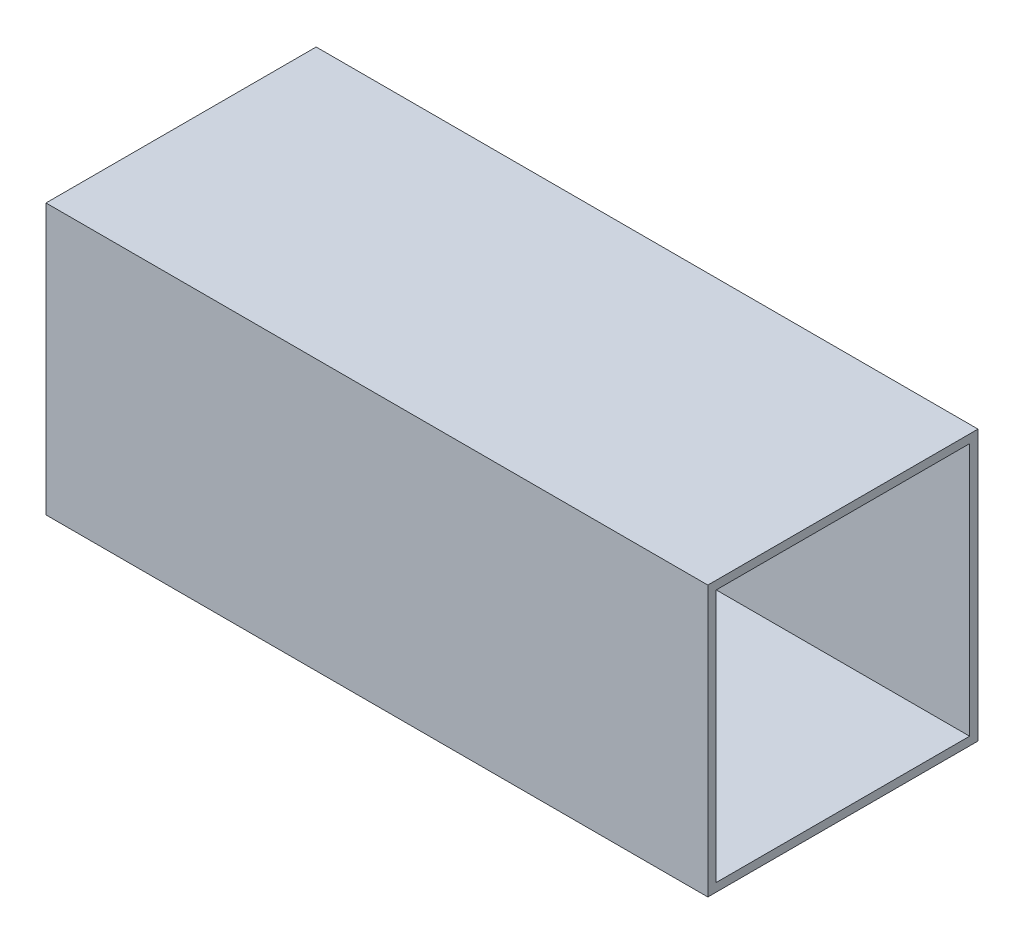
ISO-10303-21;
HEADER;
FILE_DESCRIPTION(('STEP AP214'),'2;1');
FILE_NAME('part.step','',(''),(''),'','','');
FILE_SCHEMA(('AUTOMOTIVE_DESIGN { 1 0 10303 214 1 1 1 1 }'));
ENDSEC;
DATA;
#1=APPLICATION_CONTEXT('core data for automotive mechanical design processes');
#2=APPLICATION_PROTOCOL_DEFINITION('international standard','automotive_design',2000,#1);
#3=PRODUCT_CONTEXT('',#1,'mechanical');
#4=PRODUCT('Part','Part','',(#3));
#5=PRODUCT_RELATED_PRODUCT_CATEGORY('part','',(#4));
#6=PRODUCT_DEFINITION_FORMATION('','',#4);
#7=PRODUCT_DEFINITION_CONTEXT('part definition',#1,'design');
#8=PRODUCT_DEFINITION('design','',#6,#7);
#9=PRODUCT_DEFINITION_SHAPE('','',#8);
#10=(LENGTH_UNIT() NAMED_UNIT(*) SI_UNIT(.MILLI.,.METRE.));
#11=(NAMED_UNIT(*) PLANE_ANGLE_UNIT() SI_UNIT($,.RADIAN.));
#12=(NAMED_UNIT(*) SI_UNIT($,.STERADIAN.) SOLID_ANGLE_UNIT());
#13=UNCERTAINTY_MEASURE_WITH_UNIT(LENGTH_MEASURE(1.E-05),#10,'distance_accuracy_value','');
#14=(GEOMETRIC_REPRESENTATION_CONTEXT(3) GLOBAL_UNCERTAINTY_ASSIGNED_CONTEXT((#13)) GLOBAL_UNIT_ASSIGNED_CONTEXT((#10,
#11,#12)) REPRESENTATION_CONTEXT('',''));
#15=CARTESIAN_POINT('',(0.,0.,0.));
#16=DIRECTION('',(0.,0.,1.));
#17=DIRECTION('',(1.,0.,0.));
#18=AXIS2_PLACEMENT_3D('',#15,#16,#17);
#19=CARTESIAN_POINT('',(70.0000000000005,14.2875,14.2875));
#20=DIRECTION('',(0.,-1.,0.));
#21=DIRECTION('',(0.,0.,-1.));
#22=AXIS2_PLACEMENT_3D('',#19,#20,#21);
#23=PLANE('',#22);
#24=DIRECTION('',(0.,0.,1.));
#25=VECTOR('',#24,1.);
#26=CARTESIAN_POINT('',(0.,14.2875,14.2875));
#27=LINE('',#26,#25);
#28=CARTESIAN_POINT('',(0.,14.2875,-14.2875));
#29=VERTEX_POINT('',#28);
#30=CARTESIAN_POINT('',(0.,14.2875,14.2875));
#31=VERTEX_POINT('',#30);
#32=EDGE_CURVE('E153',#29,#31,#27,.T.);
#33=ORIENTED_EDGE('',*,*,#32,.T.);
#34=DIRECTION('',(-1.00000000000001,0.,0.));
#35=VECTOR('',#34,1.);
#36=CARTESIAN_POINT('',(70.0000000000005,14.2875,14.2875));
#37=LINE('',#36,#35);
#38=CARTESIAN_POINT('',(70.0000000000005,14.2875,14.2875));
#39=VERTEX_POINT('',#38);
#40=EDGE_CURVE('E12',#39,#31,#37,.T.);
#41=ORIENTED_EDGE('',*,*,#40,.F.);
#42=DIRECTION('',(0.,0.,1.));
#43=VECTOR('',#42,1.);
#44=CARTESIAN_POINT('',(70.0000000000005,14.2875,14.2875));
#45=LINE('',#44,#43);
#46=CARTESIAN_POINT('',(70.0000000000003,14.2875,-14.2875));
#47=VERTEX_POINT('',#46);
#48=EDGE_CURVE('E127',#47,#39,#45,.T.);
#49=ORIENTED_EDGE('',*,*,#48,.F.);
#50=DIRECTION('',(-1.00000000000001,0.,0.));
#51=VECTOR('',#50,1.);
#52=CARTESIAN_POINT('',(70.0000000000003,14.2875,-14.2875));
#53=LINE('',#52,#51);
#54=EDGE_CURVE('E160',#47,#29,#53,.T.);
#55=ORIENTED_EDGE('',*,*,#54,.T.);
#56=EDGE_LOOP('',(#33,#41,#49,#55));
#57=FACE_BOUND('',#56,.T.);
#58=ADVANCED_FACE('F46',(#57),#23,.F.);
#59=CARTESIAN_POINT('',(70.0000000000005,14.2875,14.2875));
#60=DIRECTION('',(0.,0.,-1.));
#61=DIRECTION('',(-1.00000000000001,0.,0.));
#62=AXIS2_PLACEMENT_3D('',#59,#60,#61);
#63=PLANE('',#62);
#64=DIRECTION('',(0.,-1.,0.));
#65=VECTOR('',#64,1.);
#66=CARTESIAN_POINT('',(0.,14.2875,14.2875));
#67=LINE('',#66,#65);
#68=CARTESIAN_POINT('',(0.,-14.2875,14.2875));
#69=VERTEX_POINT('',#68);
#70=EDGE_CURVE('E132',#31,#69,#67,.T.);
#71=ORIENTED_EDGE('',*,*,#70,.T.);
#72=DIRECTION('',(-1.00000000000001,0.,0.));
#73=VECTOR('',#72,1.);
#74=CARTESIAN_POINT('',(70.0000000000006,-14.2875,14.2875));
#75=LINE('',#74,#73);
#76=CARTESIAN_POINT('',(70.0000000000006,-14.2875,14.2875));
#77=VERTEX_POINT('',#76);
#78=EDGE_CURVE('E56',#77,#69,#75,.T.);
#79=ORIENTED_EDGE('',*,*,#78,.F.);
#80=DIRECTION('',(0.,-1.,0.));
#81=VECTOR('',#80,1.);
#82=CARTESIAN_POINT('',(70.0000000000005,14.2875,14.2875));
#83=LINE('',#82,#81);
#84=EDGE_CURVE('E121',#39,#77,#83,.T.);
#85=ORIENTED_EDGE('',*,*,#84,.F.);
#86=ORIENTED_EDGE('',*,*,#40,.T.);
#87=EDGE_LOOP('',(#71,#79,#85,#86));
#88=FACE_BOUND('',#87,.T.);
#89=ADVANCED_FACE('F131',(#88),#63,.F.);
#90=CARTESIAN_POINT('',(70.0000000000005,-14.2875,-14.2875));
#91=DIRECTION('',(0.,1.,0.));
#92=DIRECTION('',(0.,0.,1.));
#93=AXIS2_PLACEMENT_3D('',#90,#91,#92);
#94=PLANE('',#93);
#95=DIRECTION('',(0.,0.,-1.));
#96=VECTOR('',#95,1.);
#97=CARTESIAN_POINT('',(0.,-14.2875,-14.2875));
#98=LINE('',#97,#96);
#99=CARTESIAN_POINT('',(0.,-14.2875,-14.2875));
#100=VERTEX_POINT('',#99);
#101=EDGE_CURVE('E94',#69,#100,#98,.T.);
#102=ORIENTED_EDGE('',*,*,#101,.T.);
#103=DIRECTION('',(-1.00000000000001,0.,0.));
#104=VECTOR('',#103,1.);
#105=CARTESIAN_POINT('',(70.0000000000005,-14.2875,-14.2875));
#106=LINE('',#105,#104);
#107=CARTESIAN_POINT('',(70.0000000000005,-14.2875,-14.2875));
#108=VERTEX_POINT('',#107);
#109=EDGE_CURVE('E133',#108,#100,#106,.T.);
#110=ORIENTED_EDGE('',*,*,#109,.F.);
#111=DIRECTION('',(0.,0.,-1.));
#112=VECTOR('',#111,1.);
#113=CARTESIAN_POINT('',(70.0000000000005,-14.2875,-14.2875));
#114=LINE('',#113,#112);
#115=EDGE_CURVE('E125',#77,#108,#114,.T.);
#116=ORIENTED_EDGE('',*,*,#115,.F.);
#117=ORIENTED_EDGE('',*,*,#78,.T.);
#118=EDGE_LOOP('',(#102,#110,#116,#117));
#119=FACE_BOUND('',#118,.T.);
#120=ADVANCED_FACE('F135',(#119),#94,.F.);
#121=CARTESIAN_POINT('',(70.0000000000005,13.3985,13.3985000000001));
#122=DIRECTION('',(0.,0.,-1.));
#123=DIRECTION('',(-1.00000000000001,0.,0.));
#124=AXIS2_PLACEMENT_3D('',#121,#122,#123);
#125=PLANE('',#124);
#126=DIRECTION('',(0.,-1.,0.));
#127=VECTOR('',#126,1.);
#128=CARTESIAN_POINT('',(0.,13.3985,13.3985000000001));
#129=LINE('',#128,#127);
#130=CARTESIAN_POINT('',(0.,13.3985,13.3985000000001));
#131=VERTEX_POINT('',#130);
#132=CARTESIAN_POINT('',(0.,-13.3985,13.3985000000001));
#133=VERTEX_POINT('',#132);
#134=EDGE_CURVE('E141',#131,#133,#129,.T.);
#135=ORIENTED_EDGE('',*,*,#134,.F.);
#136=DIRECTION('',(-1.00000000000001,0.,0.));
#137=VECTOR('',#136,1.);
#138=CARTESIAN_POINT('',(70.0000000000005,13.3985,13.3985000000001));
#139=LINE('',#138,#137);
#140=CARTESIAN_POINT('',(70.0000000000005,13.3985,13.3985000000001));
#141=VERTEX_POINT('',#140);
#142=EDGE_CURVE('E50',#141,#131,#139,.T.);
#143=ORIENTED_EDGE('',*,*,#142,.F.);
#144=DIRECTION('',(0.,-1.,0.));
#145=VECTOR('',#144,1.);
#146=CARTESIAN_POINT('',(70.0000000000005,13.3985,13.3985000000001));
#147=LINE('',#146,#145);
#148=CARTESIAN_POINT('',(70.0000000000006,-13.3985,13.3985000000001));
#149=VERTEX_POINT('',#148);
#150=EDGE_CURVE('E159',#141,#149,#147,.T.);
#151=ORIENTED_EDGE('',*,*,#150,.T.);
#152=DIRECTION('',(-1.00000000000001,0.,0.));
#153=VECTOR('',#152,1.);
#154=CARTESIAN_POINT('',(70.0000000000006,-13.3985,13.3985000000001));
#155=LINE('',#154,#153);
#156=EDGE_CURVE('E137',#149,#133,#155,.T.);
#157=ORIENTED_EDGE('',*,*,#156,.T.);
#158=EDGE_LOOP('',(#135,#143,#151,#157));
#159=FACE_BOUND('',#158,.T.);
#160=ADVANCED_FACE('F48',(#159),#125,.T.);
#161=CARTESIAN_POINT('',(70.0000000000005,13.3985,13.3985000000001));
#162=DIRECTION('',(0.,-1.,0.));
#163=DIRECTION('',(0.,0.,-1.));
#164=AXIS2_PLACEMENT_3D('',#161,#162,#163);
#165=PLANE('',#164);
#166=DIRECTION('',(0.,0.,1.));
#167=VECTOR('',#166,1.);
#168=CARTESIAN_POINT('',(0.,13.3985,13.3985000000001));
#169=LINE('',#168,#167);
#170=CARTESIAN_POINT('',(0.,13.3985,-13.3985000000001));
#171=VERTEX_POINT('',#170);
#172=EDGE_CURVE('E144',#171,#131,#169,.T.);
#173=ORIENTED_EDGE('',*,*,#172,.F.);
#174=DIRECTION('',(-1.00000000000001,0.,0.));
#175=VECTOR('',#174,1.);
#176=CARTESIAN_POINT('',(70.0000000000003,13.3985,-13.3985000000001));
#177=LINE('',#176,#175);
#178=CARTESIAN_POINT('',(70.0000000000003,13.3985,-13.3985000000001));
#179=VERTEX_POINT('',#178);
#180=EDGE_CURVE('E165',#179,#171,#177,.T.);
#181=ORIENTED_EDGE('',*,*,#180,.F.);
#182=DIRECTION('',(0.,0.,1.));
#183=VECTOR('',#182,1.);
#184=CARTESIAN_POINT('',(70.0000000000005,13.3985,13.3985000000001));
#185=LINE('',#184,#183);
#186=EDGE_CURVE('E174',#179,#141,#185,.T.);
#187=ORIENTED_EDGE('',*,*,#186,.T.);
#188=ORIENTED_EDGE('',*,*,#142,.T.);
#189=EDGE_LOOP('',(#173,#181,#187,#188));
#190=FACE_BOUND('',#189,.T.);
#191=ADVANCED_FACE('F172',(#190),#165,.T.);
#192=CARTESIAN_POINT('',(70.0000000000005,-13.3985,-13.3985000000001));
#193=DIRECTION('',(0.,0.,1.));
#194=DIRECTION('',(1.00000000000001,0.,0.));
#195=AXIS2_PLACEMENT_3D('',#192,#193,#194);
#196=PLANE('',#195);
#197=DIRECTION('',(0.,1.,0.));
#198=VECTOR('',#197,1.);
#199=CARTESIAN_POINT('',(0.,-13.3985,-13.3985000000001));
#200=LINE('',#199,#198);
#201=CARTESIAN_POINT('',(0.,-13.3985,-13.3985000000001));
#202=VERTEX_POINT('',#201);
#203=EDGE_CURVE('E147',#202,#171,#200,.T.);
#204=ORIENTED_EDGE('',*,*,#203,.F.);
#205=DIRECTION('',(-1.00000000000001,0.,0.));
#206=VECTOR('',#205,1.);
#207=CARTESIAN_POINT('',(70.0000000000005,-13.3985,-13.3985000000001));
#208=LINE('',#207,#206);
#209=CARTESIAN_POINT('',(70.0000000000005,-13.3985,-13.3985000000001));
#210=VERTEX_POINT('',#209);
#211=EDGE_CURVE('E164',#210,#202,#208,.T.);
#212=ORIENTED_EDGE('',*,*,#211,.F.);
#213=DIRECTION('',(0.,1.,0.));
#214=VECTOR('',#213,1.);
#215=CARTESIAN_POINT('',(70.0000000000005,-13.3985,-13.3985000000001));
#216=LINE('',#215,#214);
#217=EDGE_CURVE('E181',#210,#179,#216,.T.);
#218=ORIENTED_EDGE('',*,*,#217,.T.);
#219=ORIENTED_EDGE('',*,*,#180,.T.);
#220=EDGE_LOOP('',(#204,#212,#218,#219));
#221=FACE_BOUND('',#220,.T.);
#222=ADVANCED_FACE('F179',(#221),#196,.T.);
#223=CARTESIAN_POINT('',(70.0000000000005,-13.3985,-13.3985000000001));
#224=DIRECTION('',(0.,1.,0.));
#225=DIRECTION('',(0.,0.,1.));
#226=AXIS2_PLACEMENT_3D('',#223,#224,#225);
#227=PLANE('',#226);
#228=DIRECTION('',(0.,0.,-1.));
#229=VECTOR('',#228,1.);
#230=CARTESIAN_POINT('',(0.,-13.3985,-13.3985000000001));
#231=LINE('',#230,#229);
#232=EDGE_CURVE('E150',#133,#202,#231,.T.);
#233=ORIENTED_EDGE('',*,*,#232,.F.);
#234=ORIENTED_EDGE('',*,*,#156,.F.);
#235=DIRECTION('',(0.,0.,-1.));
#236=VECTOR('',#235,1.);
#237=CARTESIAN_POINT('',(70.0000000000005,-13.3985,-13.3985000000001));
#238=LINE('',#237,#236);
#239=EDGE_CURVE('E186',#149,#210,#238,.T.);
#240=ORIENTED_EDGE('',*,*,#239,.T.);
#241=ORIENTED_EDGE('',*,*,#211,.T.);
#242=EDGE_LOOP('',(#233,#234,#240,#241));
#243=FACE_BOUND('',#242,.T.);
#244=ADVANCED_FACE('F188',(#243),#227,.T.);
#245=CARTESIAN_POINT('',(70.0000000000005,-14.2875,-14.2875));
#246=DIRECTION('',(0.,0.,1.));
#247=DIRECTION('',(0.,-1.,0.));
#248=AXIS2_PLACEMENT_3D('',#245,#246,#247);
#249=PLANE('',#248);
#250=DIRECTION('',(0.,1.,0.));
#251=VECTOR('',#250,1.);
#252=CARTESIAN_POINT('',(0.,-14.2875,-14.2875));
#253=LINE('',#252,#251);
#254=EDGE_CURVE('E100',#100,#29,#253,.T.);
#255=ORIENTED_EDGE('',*,*,#254,.T.);
#256=ORIENTED_EDGE('',*,*,#54,.F.);
#257=DIRECTION('',(0.,1.,0.));
#258=VECTOR('',#257,1.);
#259=CARTESIAN_POINT('',(70.0000000000005,-14.2875,-14.2875));
#260=LINE('',#259,#258);
#261=EDGE_CURVE('E65',#108,#47,#260,.T.);
#262=ORIENTED_EDGE('',*,*,#261,.F.);
#263=ORIENTED_EDGE('',*,*,#109,.T.);
#264=EDGE_LOOP('',(#255,#256,#262,#263));
#265=FACE_BOUND('',#264,.T.);
#266=ADVANCED_FACE('F193',(#265),#249,.F.);
#267=CARTESIAN_POINT('',(70.0000000000003,0.,0.));
#268=DIRECTION('',(1.00000000000001,0.,0.));
#269=DIRECTION('',(0.,0.,-1.));
#270=AXIS2_PLACEMENT_3D('',#267,#268,#269);
#271=PLANE('',#270);
#272=ORIENTED_EDGE('',*,*,#150,.F.);
#273=ORIENTED_EDGE('',*,*,#186,.F.);
#274=ORIENTED_EDGE('',*,*,#217,.F.);
#275=ORIENTED_EDGE('',*,*,#239,.F.);
#276=EDGE_LOOP('',(#272,#273,#274,#275));
#277=FACE_BOUND('',#276,.T.);
#278=ORIENTED_EDGE('',*,*,#48,.T.);
#279=ORIENTED_EDGE('',*,*,#84,.T.);
#280=ORIENTED_EDGE('',*,*,#115,.T.);
#281=ORIENTED_EDGE('',*,*,#261,.T.);
#282=EDGE_LOOP('',(#278,#279,#280,#281));
#283=FACE_BOUND('',#282,.T.);
#284=ADVANCED_FACE('F123',(#277,#283),#271,.T.);
#285=CARTESIAN_POINT('',(0.,0.,0.));
#286=DIRECTION('',(1.00000000000001,0.,0.));
#287=DIRECTION('',(0.,0.,-1.));
#288=AXIS2_PLACEMENT_3D('',#285,#286,#287);
#289=PLANE('',#288);
#290=ORIENTED_EDGE('',*,*,#134,.T.);
#291=ORIENTED_EDGE('',*,*,#232,.T.);
#292=ORIENTED_EDGE('',*,*,#203,.T.);
#293=ORIENTED_EDGE('',*,*,#172,.T.);
#294=EDGE_LOOP('',(#290,#291,#292,#293));
#295=FACE_BOUND('',#294,.T.);
#296=ORIENTED_EDGE('',*,*,#32,.F.);
#297=ORIENTED_EDGE('',*,*,#254,.F.);
#298=ORIENTED_EDGE('',*,*,#101,.F.);
#299=ORIENTED_EDGE('',*,*,#70,.F.);
#300=EDGE_LOOP('',(#296,#297,#298,#299));
#301=FACE_BOUND('',#300,.T.);
#302=ADVANCED_FACE('F177',(#295,#301),#289,.F.);
#303=CLOSED_SHELL('',(#58,#89,#120,#160,#191,#222,#244,#266,#284,#302));
#304=MANIFOLD_SOLID_BREP('B2',#303);
#305=ADVANCED_BREP_SHAPE_REPRESENTATION('',(#18,#304),#14);
#306=SHAPE_DEFINITION_REPRESENTATION(#9,#305);
ENDSEC;
END-ISO-10303-21;
